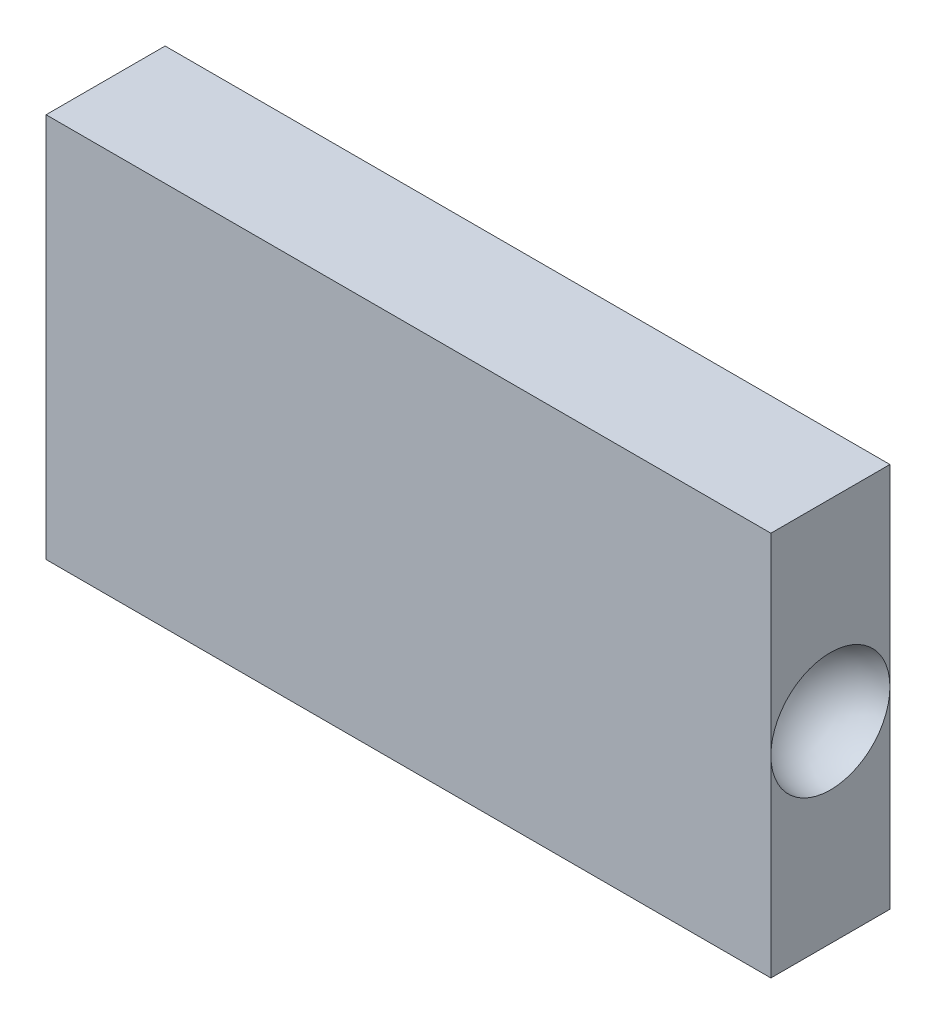
ISO-10303-21;
HEADER;
FILE_DESCRIPTION(('STEP AP214'),'2;1');
FILE_NAME('part.step','',(''),(''),'','','');
FILE_SCHEMA(('AUTOMOTIVE_DESIGN { 1 0 10303 214 1 1 1 1 }'));
ENDSEC;
DATA;
#1=APPLICATION_CONTEXT('core data for automotive mechanical design processes');
#2=APPLICATION_PROTOCOL_DEFINITION('international standard','automotive_design',2000,#1);
#3=PRODUCT_CONTEXT('',#1,'mechanical');
#4=PRODUCT('Part','Part','',(#3));
#5=PRODUCT_RELATED_PRODUCT_CATEGORY('part','',(#4));
#6=PRODUCT_DEFINITION_FORMATION('','',#4);
#7=PRODUCT_DEFINITION_CONTEXT('part definition',#1,'design');
#8=PRODUCT_DEFINITION('design','',#6,#7);
#9=PRODUCT_DEFINITION_SHAPE('','',#8);
#10=(LENGTH_UNIT() NAMED_UNIT(*) SI_UNIT(.MILLI.,.METRE.));
#11=(NAMED_UNIT(*) PLANE_ANGLE_UNIT() SI_UNIT($,.RADIAN.));
#12=(NAMED_UNIT(*) SI_UNIT($,.STERADIAN.) SOLID_ANGLE_UNIT());
#13=UNCERTAINTY_MEASURE_WITH_UNIT(LENGTH_MEASURE(1.E-05),#10,'distance_accuracy_value','');
#14=(GEOMETRIC_REPRESENTATION_CONTEXT(3) GLOBAL_UNCERTAINTY_ASSIGNED_CONTEXT((#13)) GLOBAL_UNIT_ASSIGNED_CONTEXT((#10,
#11,#12)) REPRESENTATION_CONTEXT('',''));
#15=CARTESIAN_POINT('',(0.,0.,0.));
#16=DIRECTION('',(0.,0.,1.));
#17=DIRECTION('',(1.,0.,0.));
#18=AXIS2_PLACEMENT_3D('',#15,#16,#17);
#19=CARTESIAN_POINT('',(30.444251919206,16.1799561465484,10.));
#20=DIRECTION('',(-1.,0.,0.));
#21=DIRECTION('',(0.,0.,1.));
#22=AXIS2_PLACEMENT_3D('',#19,#20,#21);
#23=PLANE('',#22);
#24=CARTESIAN_POINT('',(30.444251919206,0.,5.));
#25=DIRECTION('',(-1.,0.,0.));
#26=DIRECTION('',(0.,0.,1.));
#27=AXIS2_PLACEMENT_3D('',#24,#25,#26);
#28=CIRCLE('',#27,5.);
#29=CARTESIAN_POINT('',(30.444251919206,0.,10.));
#30=VERTEX_POINT('',#29);
#31=CARTESIAN_POINT('',(30.444251919206,0.,0.));
#32=VERTEX_POINT('',#31);
#33=EDGE_CURVE('E11',#30,#32,#28,.F.);
#34=ORIENTED_EDGE('',*,*,#33,.F.);
#35=DIRECTION('',(0.,1.,0.));
#36=VECTOR('',#35,1.);
#37=CARTESIAN_POINT('',(30.444251919206,16.1799561465484,10.));
#38=LINE('',#37,#36);
#39=CARTESIAN_POINT('',(30.444251919206,-16.1799561465484,10.));
#40=VERTEX_POINT('',#39);
#41=EDGE_CURVE('E104',#40,#30,#38,.T.);
#42=ORIENTED_EDGE('',*,*,#41,.F.);
#43=DIRECTION('',(0.,0.,-1.));
#44=VECTOR('',#43,1.);
#45=CARTESIAN_POINT('',(30.444251919206,-16.1799561465484,10.));
#46=LINE('',#45,#44);
#47=CARTESIAN_POINT('',(30.444251919206,-16.1799561465484,0.));
#48=VERTEX_POINT('',#47);
#49=EDGE_CURVE('E132',#40,#48,#46,.T.);
#50=ORIENTED_EDGE('',*,*,#49,.T.);
#51=DIRECTION('',(0.,1.,0.));
#52=VECTOR('',#51,1.);
#53=CARTESIAN_POINT('',(30.444251919206,16.1799561465484,0.));
#54=LINE('',#53,#52);
#55=EDGE_CURVE('E106',#48,#32,#54,.T.);
#56=ORIENTED_EDGE('',*,*,#55,.T.);
#57=EDGE_LOOP('',(#34,#42,#50,#56));
#58=FACE_BOUND('',#57,.T.);
#59=ADVANCED_FACE('F44',(#58),#23,.F.);
#60=CARTESIAN_POINT('',(-30.444251919206,16.1799561465484,10.));
#61=DIRECTION('',(1.,0.,0.));
#62=DIRECTION('',(0.,1.,0.));
#63=AXIS2_PLACEMENT_3D('',#60,#61,#62);
#64=PLANE('',#63);
#65=CARTESIAN_POINT('',(-30.444251919206,0.,5.));
#66=DIRECTION('',(1.,0.,0.));
#67=DIRECTION('',(0.,1.,0.));
#68=AXIS2_PLACEMENT_3D('',#65,#66,#67);
#69=CIRCLE('',#68,5.);
#70=CARTESIAN_POINT('',(-30.444251919206,0.,0.));
#71=VERTEX_POINT('',#70);
#72=CARTESIAN_POINT('',(-30.444251919206,0.,10.));
#73=VERTEX_POINT('',#72);
#74=EDGE_CURVE('E65',#71,#73,#69,.F.);
#75=ORIENTED_EDGE('',*,*,#74,.F.);
#76=DIRECTION('',(0.,-1.,0.));
#77=VECTOR('',#76,1.);
#78=CARTESIAN_POINT('',(-30.444251919206,16.1799561465484,0.));
#79=LINE('',#78,#77);
#80=CARTESIAN_POINT('',(-30.444251919206,-16.1799561465484,0.));
#81=VERTEX_POINT('',#80);
#82=EDGE_CURVE('E139',#71,#81,#79,.T.);
#83=ORIENTED_EDGE('',*,*,#82,.T.);
#84=DIRECTION('',(0.,0.,-1.));
#85=VECTOR('',#84,1.);
#86=CARTESIAN_POINT('',(-30.444251919206,-16.1799561465484,10.));
#87=LINE('',#86,#85);
#88=CARTESIAN_POINT('',(-30.444251919206,-16.1799561465484,10.));
#89=VERTEX_POINT('',#88);
#90=EDGE_CURVE('E148',#89,#81,#87,.T.);
#91=ORIENTED_EDGE('',*,*,#90,.F.);
#92=DIRECTION('',(0.,-1.,0.));
#93=VECTOR('',#92,1.);
#94=CARTESIAN_POINT('',(-30.444251919206,16.1799561465484,10.));
#95=LINE('',#94,#93);
#96=EDGE_CURVE('E123',#73,#89,#95,.T.);
#97=ORIENTED_EDGE('',*,*,#96,.F.);
#98=EDGE_LOOP('',(#75,#83,#91,#97));
#99=FACE_BOUND('',#98,.T.);
#100=ADVANCED_FACE('F167',(#99),#64,.F.);
#101=EDGE_CURVE('E54',#32,#30,#28,.F.);
#102=ORIENTED_EDGE('',*,*,#101,.F.);
#103=CARTESIAN_POINT('',(30.444251919206,16.1799561465484,0.));
#104=VERTEX_POINT('',#103);
#105=EDGE_CURVE('E136',#32,#104,#54,.T.);
#106=ORIENTED_EDGE('',*,*,#105,.T.);
#107=DIRECTION('',(0.,0.,-1.));
#108=VECTOR('',#107,1.);
#109=CARTESIAN_POINT('',(30.444251919206,16.1799561465484,10.));
#110=LINE('',#109,#108);
#111=CARTESIAN_POINT('',(30.444251919206,16.1799561465484,10.));
#112=VERTEX_POINT('',#111);
#113=EDGE_CURVE('E110',#112,#104,#110,.T.);
#114=ORIENTED_EDGE('',*,*,#113,.F.);
#115=EDGE_CURVE('E108',#30,#112,#38,.T.);
#116=ORIENTED_EDGE('',*,*,#115,.F.);
#117=EDGE_LOOP('',(#102,#106,#114,#116));
#118=FACE_BOUND('',#117,.T.);
#119=ADVANCED_FACE('F46',(#118),#23,.F.);
#120=CARTESIAN_POINT('',(-30.444251919206,16.1799561465484,10.));
#121=DIRECTION('',(0.,-1.,0.));
#122=DIRECTION('',(0.,0.,-1.));
#123=AXIS2_PLACEMENT_3D('',#120,#121,#122);
#124=PLANE('',#123);
#125=DIRECTION('',(-1.,0.,0.));
#126=VECTOR('',#125,1.);
#127=CARTESIAN_POINT('',(-30.444251919206,16.1799561465484,0.));
#128=LINE('',#127,#126);
#129=CARTESIAN_POINT('',(-30.444251919206,16.1799561465484,0.));
#130=VERTEX_POINT('',#129);
#131=EDGE_CURVE('E135',#104,#130,#128,.T.);
#132=ORIENTED_EDGE('',*,*,#131,.T.);
#133=DIRECTION('',(0.,0.,-1.));
#134=VECTOR('',#133,1.);
#135=CARTESIAN_POINT('',(-30.444251919206,16.1799561465484,10.));
#136=LINE('',#135,#134);
#137=CARTESIAN_POINT('',(-30.444251919206,16.1799561465484,10.));
#138=VERTEX_POINT('',#137);
#139=EDGE_CURVE('E152',#138,#130,#136,.T.);
#140=ORIENTED_EDGE('',*,*,#139,.F.);
#141=DIRECTION('',(-1.,0.,0.));
#142=VECTOR('',#141,1.);
#143=CARTESIAN_POINT('',(-30.444251919206,16.1799561465484,10.));
#144=LINE('',#143,#142);
#145=EDGE_CURVE('E121',#112,#138,#144,.T.);
#146=ORIENTED_EDGE('',*,*,#145,.F.);
#147=ORIENTED_EDGE('',*,*,#113,.T.);
#148=EDGE_LOOP('',(#132,#140,#146,#147));
#149=FACE_BOUND('',#148,.T.);
#150=ADVANCED_FACE('F178',(#149),#124,.F.);
#151=EDGE_CURVE('E158',#73,#71,#69,.F.);
#152=ORIENTED_EDGE('',*,*,#151,.F.);
#153=EDGE_CURVE('E126',#138,#73,#95,.T.);
#154=ORIENTED_EDGE('',*,*,#153,.F.);
#155=ORIENTED_EDGE('',*,*,#139,.T.);
#156=EDGE_CURVE('E140',#130,#71,#79,.T.);
#157=ORIENTED_EDGE('',*,*,#156,.T.);
#158=EDGE_LOOP('',(#152,#154,#155,#157));
#159=FACE_BOUND('',#158,.T.);
#160=ADVANCED_FACE('F175',(#159),#64,.F.);
#161=CARTESIAN_POINT('',(-30.444251919206,-16.1799561465484,10.));
#162=DIRECTION('',(0.,1.,0.));
#163=DIRECTION('',(0.,0.,1.));
#164=AXIS2_PLACEMENT_3D('',#161,#162,#163);
#165=PLANE('',#164);
#166=DIRECTION('',(1.,0.,0.));
#167=VECTOR('',#166,1.);
#168=CARTESIAN_POINT('',(-30.444251919206,-16.1799561465484,0.));
#169=LINE('',#168,#167);
#170=EDGE_CURVE('E114',#81,#48,#169,.T.);
#171=ORIENTED_EDGE('',*,*,#170,.T.);
#172=ORIENTED_EDGE('',*,*,#49,.F.);
#173=DIRECTION('',(1.,0.,0.));
#174=VECTOR('',#173,1.);
#175=CARTESIAN_POINT('',(-30.444251919206,-16.1799561465484,10.));
#176=LINE('',#175,#174);
#177=EDGE_CURVE('E118',#89,#40,#176,.T.);
#178=ORIENTED_EDGE('',*,*,#177,.F.);
#179=ORIENTED_EDGE('',*,*,#90,.T.);
#180=EDGE_LOOP('',(#171,#172,#178,#179));
#181=FACE_BOUND('',#180,.T.);
#182=ADVANCED_FACE('F208',(#181),#165,.F.);
#183=CARTESIAN_POINT('',(0.,0.,10.));
#184=DIRECTION('',(0.,0.,1.));
#185=DIRECTION('',(1.,0.,0.));
#186=AXIS2_PLACEMENT_3D('',#183,#184,#185);
#187=PLANE('',#186);
#188=ORIENTED_EDGE('',*,*,#41,.T.);
#189=ORIENTED_EDGE('',*,*,#115,.T.);
#190=ORIENTED_EDGE('',*,*,#145,.T.);
#191=ORIENTED_EDGE('',*,*,#153,.T.);
#192=ORIENTED_EDGE('',*,*,#96,.T.);
#193=ORIENTED_EDGE('',*,*,#177,.T.);
#194=EDGE_LOOP('',(#188,#189,#190,#191,#192,#193));
#195=FACE_BOUND('',#194,.T.);
#196=ADVANCED_FACE('F116',(#195),#187,.T.);
#197=CARTESIAN_POINT('',(0.,0.,0.));
#198=DIRECTION('',(0.,0.,1.));
#199=DIRECTION('',(1.,0.,0.));
#200=AXIS2_PLACEMENT_3D('',#197,#198,#199);
#201=PLANE('',#200);
#202=CARTESIAN_POINT('',(0.,0.,0.));
#203=DIRECTION('',(0.,0.,1.));
#204=DIRECTION('',(1.,0.,0.));
#205=AXIS2_PLACEMENT_3D('',#202,#203,#204);
#206=CIRCLE('',#205,4.91392602311148);
#207=CARTESIAN_POINT('',(4.91392602311148,0.,0.));
#208=VERTEX_POINT('',#207);
#209=EDGE_CURVE('E48',#208,#208,#206,.T.);
#210=ORIENTED_EDGE('',*,*,#209,.T.);
#211=EDGE_LOOP('',(#210));
#212=FACE_BOUND('',#211,.T.);
#213=ORIENTED_EDGE('',*,*,#55,.F.);
#214=ORIENTED_EDGE('',*,*,#170,.F.);
#215=ORIENTED_EDGE('',*,*,#82,.F.);
#216=ORIENTED_EDGE('',*,*,#156,.F.);
#217=ORIENTED_EDGE('',*,*,#131,.F.);
#218=ORIENTED_EDGE('',*,*,#105,.F.);
#219=EDGE_LOOP('',(#213,#214,#215,#216,#217,#218));
#220=FACE_BOUND('',#219,.T.);
#221=ADVANCED_FACE('F172',(#212,#220),#201,.F.);
#222=CARTESIAN_POINT('',(-30.444251919206,0.,5.));
#223=DIRECTION('',(0.,0.,-1.));
#224=DIRECTION('',(1.,0.,0.));
#225=AXIS2_PLACEMENT_3D('',#222,#223,#224);
#226=SPHERICAL_SURFACE('',#225,5.);
#227=CARTESIAN_POINT('',(-30.444251919206,0.,5.));
#228=DIRECTION('',(1.,0.,0.));
#229=DIRECTION('',(0.,1.,0.));
#230=AXIS2_PLACEMENT_3D('',#227,#228,#229);
#231=SPHERICAL_SURFACE('',#230,5.);
#232=ORIENTED_EDGE('',*,*,#74,.T.);
#233=ORIENTED_EDGE('',*,*,#151,.T.);
#234=EDGE_LOOP('',(#232,#233));
#235=FACE_BOUND('',#234,.T.);
#236=ADVANCED_FACE('F161',(#235),#231,.F.);
#237=CARTESIAN_POINT('',(30.444251919206,0.,5.));
#238=DIRECTION('',(0.,0.,-1.));
#239=DIRECTION('',(-1.,0.,0.));
#240=AXIS2_PLACEMENT_3D('',#237,#238,#239);
#241=SPHERICAL_SURFACE('',#240,5.);
#242=CARTESIAN_POINT('',(30.444251919206,0.,5.));
#243=DIRECTION('',(-1.,0.,0.));
#244=DIRECTION('',(0.,0.,1.));
#245=AXIS2_PLACEMENT_3D('',#242,#243,#244);
#246=SPHERICAL_SURFACE('',#245,5.);
#247=ORIENTED_EDGE('',*,*,#33,.T.);
#248=ORIENTED_EDGE('',*,*,#101,.T.);
#249=EDGE_LOOP('',(#247,#248));
#250=FACE_BOUND('',#249,.T.);
#251=ADVANCED_FACE('F94',(#250),#246,.F.);
#252=CARTESIAN_POINT('',(0.,0.,0.));
#253=DIRECTION('',(-1.,0.,0.));
#254=DIRECTION('',(0.,0.,-1.));
#255=AXIS2_PLACEMENT_3D('',#252,#253,#254);
#256=SPHERICAL_SURFACE('',#255,4.91392602311148);
#257=CARTESIAN_POINT('',(0.,0.,0.));
#258=DIRECTION('',(0.,0.,1.));
#259=DIRECTION('',(1.,0.,0.));
#260=AXIS2_PLACEMENT_3D('',#257,#258,#259);
#261=SPHERICAL_SURFACE('',#260,4.91392602311148);
#262=ORIENTED_EDGE('',*,*,#209,.F.);
#263=EDGE_LOOP('',(#262));
#264=FACE_BOUND('',#263,.T.);
#265=ADVANCED_FACE('F185',(#264),#261,.F.);
#266=CLOSED_SHELL('',(#59,#100,#119,#150,#160,#182,#196,#221,#236,#251,#265));
#267=MANIFOLD_SOLID_BREP('B2',#266);
#268=ADVANCED_BREP_SHAPE_REPRESENTATION('',(#18,#267),#14);
#269=SHAPE_DEFINITION_REPRESENTATION(#9,#268);
ENDSEC;
END-ISO-10303-21;
